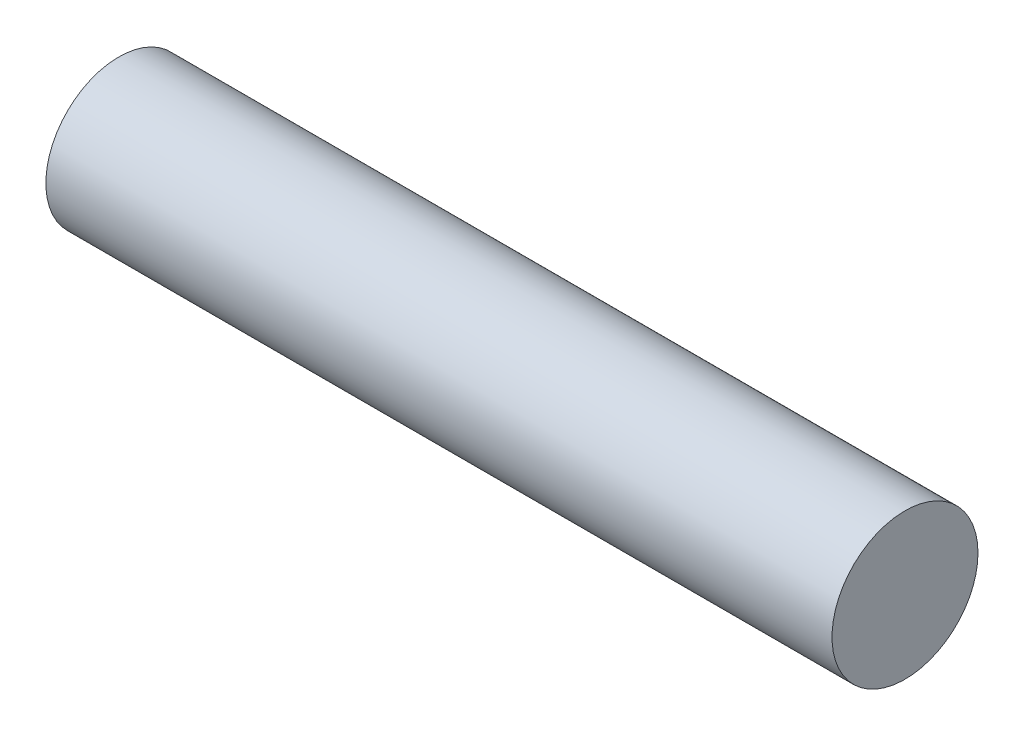
ISO-10303-21;
HEADER;
FILE_DESCRIPTION(('STEP AP214'),'2;1');
FILE_NAME('part.step','',(''),(''),'','','');
FILE_SCHEMA(('AUTOMOTIVE_DESIGN { 1 0 10303 214 1 1 1 1 }'));
ENDSEC;
DATA;
#1=APPLICATION_CONTEXT('core data for automotive mechanical design processes');
#2=APPLICATION_PROTOCOL_DEFINITION('international standard','automotive_design',2000,#1);
#3=PRODUCT_CONTEXT('',#1,'mechanical');
#4=PRODUCT('Part','Part','',(#3));
#5=PRODUCT_RELATED_PRODUCT_CATEGORY('part','',(#4));
#6=PRODUCT_DEFINITION_FORMATION('','',#4);
#7=PRODUCT_DEFINITION_CONTEXT('part definition',#1,'design');
#8=PRODUCT_DEFINITION('design','',#6,#7);
#9=PRODUCT_DEFINITION_SHAPE('','',#8);
#10=(LENGTH_UNIT() NAMED_UNIT(*) SI_UNIT(.MILLI.,.METRE.));
#11=(NAMED_UNIT(*) PLANE_ANGLE_UNIT() SI_UNIT($,.RADIAN.));
#12=(NAMED_UNIT(*) SI_UNIT($,.STERADIAN.) SOLID_ANGLE_UNIT());
#13=UNCERTAINTY_MEASURE_WITH_UNIT(LENGTH_MEASURE(1.E-05),#10,'distance_accuracy_value','');
#14=(GEOMETRIC_REPRESENTATION_CONTEXT(3) GLOBAL_UNCERTAINTY_ASSIGNED_CONTEXT((#13)) GLOBAL_UNIT_ASSIGNED_CONTEXT((#10,
#11,#12)) REPRESENTATION_CONTEXT('',''));
#15=CARTESIAN_POINT('',(0.,0.,0.));
#16=DIRECTION('',(0.,0.,1.));
#17=DIRECTION('',(1.,0.,0.));
#18=AXIS2_PLACEMENT_3D('',#15,#16,#17);
#19=CARTESIAN_POINT('',(7.,0.,0.));
#20=DIRECTION('',(-1.,0.,0.));
#21=DIRECTION('',(0.,0.,1.));
#22=AXIS2_PLACEMENT_3D('',#19,#20,#21);
#23=CYLINDRICAL_SURFACE('',#22,0.65);
#24=CARTESIAN_POINT('',(7.,0.,0.));
#25=DIRECTION('',(1.,0.,0.));
#26=DIRECTION('',(0.,0.,-1.));
#27=AXIS2_PLACEMENT_3D('',#24,#25,#26);
#28=CIRCLE('',#27,0.65);
#29=CARTESIAN_POINT('',(7.,0.,-0.65));
#30=VERTEX_POINT('',#29);
#31=EDGE_CURVE('E10',#30,#30,#28,.T.);
#32=ORIENTED_EDGE('',*,*,#31,.F.);
#33=EDGE_LOOP('',(#32));
#34=FACE_BOUND('',#33,.T.);
#35=CARTESIAN_POINT('',(0.,0.,0.));
#36=DIRECTION('',(1.,0.,0.));
#37=DIRECTION('',(0.,0.,-1.));
#38=AXIS2_PLACEMENT_3D('',#35,#36,#37);
#39=CIRCLE('',#38,0.65);
#40=CARTESIAN_POINT('',(0.,0.,-0.65));
#41=VERTEX_POINT('',#40);
#42=EDGE_CURVE('E33',#41,#41,#39,.T.);
#43=ORIENTED_EDGE('',*,*,#42,.T.);
#44=EDGE_LOOP('',(#43));
#45=FACE_BOUND('',#44,.T.);
#46=ADVANCED_FACE('F30',(#34,#45),#23,.T.);
#47=CARTESIAN_POINT('',(7.,0.,0.));
#48=DIRECTION('',(1.,0.,0.));
#49=DIRECTION('',(0.,0.,-1.));
#50=AXIS2_PLACEMENT_3D('',#47,#48,#49);
#51=PLANE('',#50);
#52=ORIENTED_EDGE('',*,*,#31,.T.);
#53=EDGE_LOOP('',(#52));
#54=FACE_BOUND('',#53,.T.);
#55=ADVANCED_FACE('F45',(#54),#51,.T.);
#56=CARTESIAN_POINT('',(0.,0.,0.));
#57=DIRECTION('',(1.,0.,0.));
#58=DIRECTION('',(0.,0.,-1.));
#59=AXIS2_PLACEMENT_3D('',#56,#57,#58);
#60=PLANE('',#59);
#61=ORIENTED_EDGE('',*,*,#42,.F.);
#62=EDGE_LOOP('',(#61));
#63=FACE_BOUND('',#62,.T.);
#64=ADVANCED_FACE('F43',(#63),#60,.F.);
#65=CLOSED_SHELL('',(#46,#55,#64));
#66=MANIFOLD_SOLID_BREP('B2',#65);
#67=ADVANCED_BREP_SHAPE_REPRESENTATION('',(#18,#66),#14);
#68=SHAPE_DEFINITION_REPRESENTATION(#9,#67);
ENDSEC;
END-ISO-10303-21;
